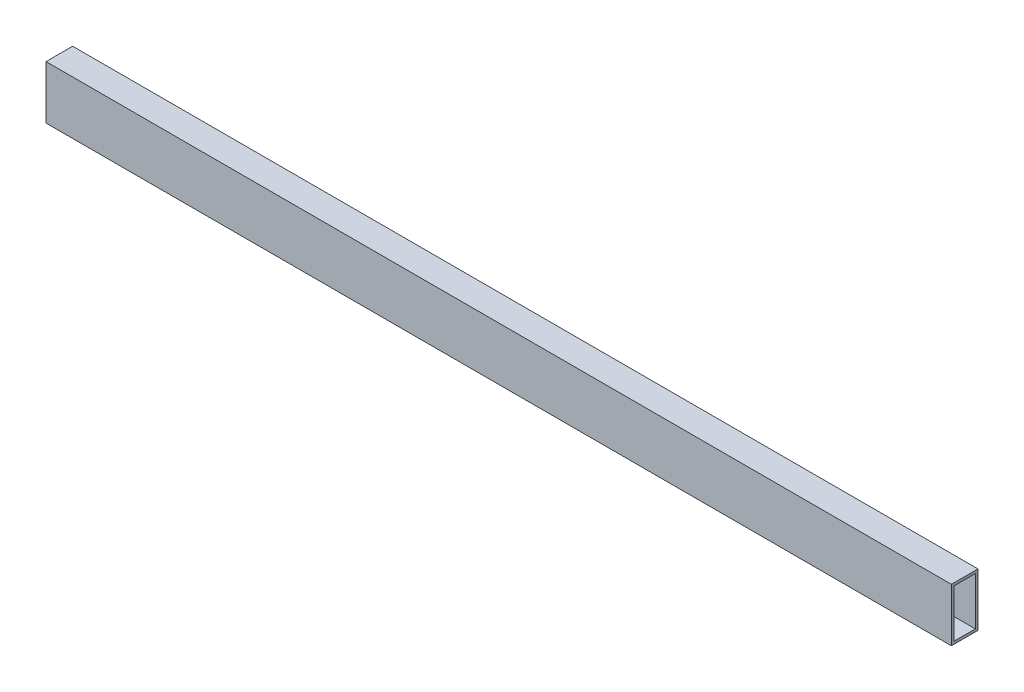
ISO-10303-21;
HEADER;
FILE_DESCRIPTION(('STEP AP214'),'2;1');
FILE_NAME('part.step','',(''),(''),'','','');
FILE_SCHEMA(('AUTOMOTIVE_DESIGN { 1 0 10303 214 1 1 1 1 }'));
ENDSEC;
DATA;
#1=APPLICATION_CONTEXT('core data for automotive mechanical design processes');
#2=APPLICATION_PROTOCOL_DEFINITION('international standard','automotive_design',2000,#1);
#3=PRODUCT_CONTEXT('',#1,'mechanical');
#4=PRODUCT('Part','Part','',(#3));
#5=PRODUCT_RELATED_PRODUCT_CATEGORY('part','',(#4));
#6=PRODUCT_DEFINITION_FORMATION('','',#4);
#7=PRODUCT_DEFINITION_CONTEXT('part definition',#1,'design');
#8=PRODUCT_DEFINITION('design','',#6,#7);
#9=PRODUCT_DEFINITION_SHAPE('','',#8);
#10=(LENGTH_UNIT() NAMED_UNIT(*) SI_UNIT(.MILLI.,.METRE.));
#11=(NAMED_UNIT(*) PLANE_ANGLE_UNIT() SI_UNIT($,.RADIAN.));
#12=(NAMED_UNIT(*) SI_UNIT($,.STERADIAN.) SOLID_ANGLE_UNIT());
#13=UNCERTAINTY_MEASURE_WITH_UNIT(LENGTH_MEASURE(1.E-05),#10,'distance_accuracy_value','');
#14=(GEOMETRIC_REPRESENTATION_CONTEXT(3) GLOBAL_UNCERTAINTY_ASSIGNED_CONTEXT((#13)) GLOBAL_UNIT_ASSIGNED_CONTEXT((#10,
#11,#12)) REPRESENTATION_CONTEXT('',''));
#15=CARTESIAN_POINT('',(0.,0.,0.));
#16=DIRECTION('',(0.,0.,1.));
#17=DIRECTION('',(1.,0.,0.));
#18=AXIS2_PLACEMENT_3D('',#15,#16,#17);
#19=CARTESIAN_POINT('',(1700.,0.,0.));
#20=DIRECTION('',(-1.,0.,0.));
#21=DIRECTION('',(0.,0.,1.));
#22=AXIS2_PLACEMENT_3D('',#19,#20,#21);
#23=PLANE('',#22);
#24=DIRECTION('',(0.,-1.,0.));
#25=VECTOR('',#24,1.);
#26=CARTESIAN_POINT('',(1700.,0.,0.));
#27=LINE('',#26,#25);
#28=CARTESIAN_POINT('',(1700.,100.,0.));
#29=VERTEX_POINT('',#28);
#30=CARTESIAN_POINT('',(1700.,0.,0.));
#31=VERTEX_POINT('',#30);
#32=EDGE_CURVE('E136',#29,#31,#27,.T.);
#33=ORIENTED_EDGE('',*,*,#32,.T.);
#34=DIRECTION('',(0.,0.,-1.));
#35=VECTOR('',#34,1.);
#36=CARTESIAN_POINT('',(1700.,0.,0.));
#37=LINE('',#36,#35);
#38=CARTESIAN_POINT('',(1700.,0.,-50.));
#39=VERTEX_POINT('',#38);
#40=EDGE_CURVE('E139',#31,#39,#37,.T.);
#41=ORIENTED_EDGE('',*,*,#40,.T.);
#42=DIRECTION('',(0.,1.,0.));
#43=VECTOR('',#42,1.);
#44=CARTESIAN_POINT('',(1700.,0.,-50.));
#45=LINE('',#44,#43);
#46=CARTESIAN_POINT('',(1700.,100.,-50.));
#47=VERTEX_POINT('',#46);
#48=EDGE_CURVE('E142',#39,#47,#45,.T.);
#49=ORIENTED_EDGE('',*,*,#48,.T.);
#50=DIRECTION('',(0.,0.,1.));
#51=VECTOR('',#50,1.);
#52=CARTESIAN_POINT('',(1700.,100.,0.));
#53=LINE('',#52,#51);
#54=EDGE_CURVE('E144',#47,#29,#53,.T.);
#55=ORIENTED_EDGE('',*,*,#54,.T.);
#56=EDGE_LOOP('',(#33,#41,#49,#55));
#57=FACE_BOUND('',#56,.T.);
#58=DIRECTION('',(0.,0.,-1.));
#59=VECTOR('',#58,1.);
#60=CARTESIAN_POINT('',(1700.,5.,-5.));
#61=LINE('',#60,#59);
#62=CARTESIAN_POINT('',(1700.,5.,-5.));
#63=VERTEX_POINT('',#62);
#64=CARTESIAN_POINT('',(1700.,5.,-45.));
#65=VERTEX_POINT('',#64);
#66=EDGE_CURVE('E100',#63,#65,#61,.T.);
#67=ORIENTED_EDGE('',*,*,#66,.F.);
#68=DIRECTION('',(0.,-1.,0.));
#69=VECTOR('',#68,1.);
#70=CARTESIAN_POINT('',(1700.,5.,-5.));
#71=LINE('',#70,#69);
#72=CARTESIAN_POINT('',(1700.,95.,-5.));
#73=VERTEX_POINT('',#72);
#74=EDGE_CURVE('E122',#73,#63,#71,.T.);
#75=ORIENTED_EDGE('',*,*,#74,.F.);
#76=DIRECTION('',(0.,0.,1.));
#77=VECTOR('',#76,1.);
#78=CARTESIAN_POINT('',(1700.,95.,-5.));
#79=LINE('',#78,#77);
#80=CARTESIAN_POINT('',(1700.,95.,-45.));
#81=VERTEX_POINT('',#80);
#82=EDGE_CURVE('E120',#81,#73,#79,.T.);
#83=ORIENTED_EDGE('',*,*,#82,.F.);
#84=DIRECTION('',(0.,1.,0.));
#85=VECTOR('',#84,1.);
#86=CARTESIAN_POINT('',(1700.,5.,-45.));
#87=LINE('',#86,#85);
#88=EDGE_CURVE('E108',#65,#81,#87,.T.);
#89=ORIENTED_EDGE('',*,*,#88,.F.);
#90=EDGE_LOOP('',(#67,#75,#83,#89));
#91=FACE_BOUND('',#90,.T.);
#92=ADVANCED_FACE('F35',(#57,#91),#23,.F.);
#93=CARTESIAN_POINT('',(0.,0.,0.));
#94=DIRECTION('',(-1.,0.,0.));
#95=DIRECTION('',(0.,0.,1.));
#96=AXIS2_PLACEMENT_3D('',#93,#94,#95);
#97=PLANE('',#96);
#98=DIRECTION('',(0.,-1.,0.));
#99=VECTOR('',#98,1.);
#100=CARTESIAN_POINT('',(0.,0.,0.));
#101=LINE('',#100,#99);
#102=CARTESIAN_POINT('',(0.,100.,0.));
#103=VERTEX_POINT('',#102);
#104=CARTESIAN_POINT('',(0.,0.,0.));
#105=VERTEX_POINT('',#104);
#106=EDGE_CURVE('E116',#103,#105,#101,.T.);
#107=ORIENTED_EDGE('',*,*,#106,.F.);
#108=DIRECTION('',(0.,0.,1.));
#109=VECTOR('',#108,1.);
#110=CARTESIAN_POINT('',(0.,100.,0.));
#111=LINE('',#110,#109);
#112=CARTESIAN_POINT('',(0.,100.,-50.));
#113=VERTEX_POINT('',#112);
#114=EDGE_CURVE('E140',#113,#103,#111,.T.);
#115=ORIENTED_EDGE('',*,*,#114,.F.);
#116=DIRECTION('',(0.,1.,0.));
#117=VECTOR('',#116,1.);
#118=CARTESIAN_POINT('',(0.,0.,-50.));
#119=LINE('',#118,#117);
#120=CARTESIAN_POINT('',(0.,0.,-50.));
#121=VERTEX_POINT('',#120);
#122=EDGE_CURVE('E151',#121,#113,#119,.T.);
#123=ORIENTED_EDGE('',*,*,#122,.F.);
#124=DIRECTION('',(0.,0.,-1.));
#125=VECTOR('',#124,1.);
#126=CARTESIAN_POINT('',(0.,0.,0.));
#127=LINE('',#126,#125);
#128=EDGE_CURVE('E149',#105,#121,#127,.T.);
#129=ORIENTED_EDGE('',*,*,#128,.F.);
#130=EDGE_LOOP('',(#107,#115,#123,#129));
#131=FACE_BOUND('',#130,.T.);
#132=DIRECTION('',(0.,-1.,0.));
#133=VECTOR('',#132,1.);
#134=CARTESIAN_POINT('',(0.,5.,-5.));
#135=LINE('',#134,#133);
#136=CARTESIAN_POINT('',(0.,95.,-5.));
#137=VERTEX_POINT('',#136);
#138=CARTESIAN_POINT('',(0.,5.,-5.));
#139=VERTEX_POINT('',#138);
#140=EDGE_CURVE('E109',#137,#139,#135,.T.);
#141=ORIENTED_EDGE('',*,*,#140,.T.);
#142=DIRECTION('',(0.,0.,-1.));
#143=VECTOR('',#142,1.);
#144=CARTESIAN_POINT('',(0.,5.,-5.));
#145=LINE('',#144,#143);
#146=CARTESIAN_POINT('',(0.,5.,-45.));
#147=VERTEX_POINT('',#146);
#148=EDGE_CURVE('E58',#139,#147,#145,.T.);
#149=ORIENTED_EDGE('',*,*,#148,.T.);
#150=DIRECTION('',(0.,1.,0.));
#151=VECTOR('',#150,1.);
#152=CARTESIAN_POINT('',(0.,5.,-45.));
#153=LINE('',#152,#151);
#154=CARTESIAN_POINT('',(0.,95.,-45.));
#155=VERTEX_POINT('',#154);
#156=EDGE_CURVE('E115',#147,#155,#153,.T.);
#157=ORIENTED_EDGE('',*,*,#156,.T.);
#158=DIRECTION('',(0.,0.,1.));
#159=VECTOR('',#158,1.);
#160=CARTESIAN_POINT('',(0.,95.,-5.));
#161=LINE('',#160,#159);
#162=EDGE_CURVE('E128',#155,#137,#161,.T.);
#163=ORIENTED_EDGE('',*,*,#162,.T.);
#164=EDGE_LOOP('',(#141,#149,#157,#163));
#165=FACE_BOUND('',#164,.T.);
#166=ADVANCED_FACE('F169',(#131,#165),#97,.T.);
#167=CARTESIAN_POINT('',(1700.,0.,0.));
#168=DIRECTION('',(0.,0.,-1.));
#169=DIRECTION('',(-1.,0.,0.));
#170=AXIS2_PLACEMENT_3D('',#167,#168,#169);
#171=PLANE('',#170);
#172=ORIENTED_EDGE('',*,*,#106,.T.);
#173=DIRECTION('',(-1.,0.,0.));
#174=VECTOR('',#173,1.);
#175=CARTESIAN_POINT('',(1700.,0.,0.));
#176=LINE('',#175,#174);
#177=EDGE_CURVE('E11',#31,#105,#176,.T.);
#178=ORIENTED_EDGE('',*,*,#177,.F.);
#179=ORIENTED_EDGE('',*,*,#32,.F.);
#180=DIRECTION('',(-1.,0.,0.));
#181=VECTOR('',#180,1.);
#182=CARTESIAN_POINT('',(1700.,100.,0.));
#183=LINE('',#182,#181);
#184=EDGE_CURVE('E146',#29,#103,#183,.T.);
#185=ORIENTED_EDGE('',*,*,#184,.T.);
#186=EDGE_LOOP('',(#172,#178,#179,#185));
#187=FACE_BOUND('',#186,.T.);
#188=ADVANCED_FACE('F37',(#187),#171,.F.);
#189=CARTESIAN_POINT('',(1700.,0.,0.));
#190=DIRECTION('',(0.,1.,0.));
#191=DIRECTION('',(0.,0.,1.));
#192=AXIS2_PLACEMENT_3D('',#189,#190,#191);
#193=PLANE('',#192);
#194=ORIENTED_EDGE('',*,*,#128,.T.);
#195=DIRECTION('',(-1.,0.,0.));
#196=VECTOR('',#195,1.);
#197=CARTESIAN_POINT('',(1700.,0.,-50.));
#198=LINE('',#197,#196);
#199=EDGE_CURVE('E43',#39,#121,#198,.T.);
#200=ORIENTED_EDGE('',*,*,#199,.F.);
#201=ORIENTED_EDGE('',*,*,#40,.F.);
#202=ORIENTED_EDGE('',*,*,#177,.T.);
#203=EDGE_LOOP('',(#194,#200,#201,#202));
#204=FACE_BOUND('',#203,.T.);
#205=ADVANCED_FACE('F179',(#204),#193,.F.);
#206=CARTESIAN_POINT('',(1700.,0.,-50.));
#207=DIRECTION('',(0.,0.,1.));
#208=DIRECTION('',(1.,0.,0.));
#209=AXIS2_PLACEMENT_3D('',#206,#207,#208);
#210=PLANE('',#209);
#211=ORIENTED_EDGE('',*,*,#122,.T.);
#212=DIRECTION('',(-1.,0.,0.));
#213=VECTOR('',#212,1.);
#214=CARTESIAN_POINT('',(1700.,100.,-50.));
#215=LINE('',#214,#213);
#216=EDGE_CURVE('E156',#47,#113,#215,.T.);
#217=ORIENTED_EDGE('',*,*,#216,.F.);
#218=ORIENTED_EDGE('',*,*,#48,.F.);
#219=ORIENTED_EDGE('',*,*,#199,.T.);
#220=EDGE_LOOP('',(#211,#217,#218,#219));
#221=FACE_BOUND('',#220,.T.);
#222=ADVANCED_FACE('F163',(#221),#210,.F.);
#223=CARTESIAN_POINT('',(1700.,100.,0.));
#224=DIRECTION('',(0.,-1.,0.));
#225=DIRECTION('',(0.,0.,-1.));
#226=AXIS2_PLACEMENT_3D('',#223,#224,#225);
#227=PLANE('',#226);
#228=ORIENTED_EDGE('',*,*,#114,.T.);
#229=ORIENTED_EDGE('',*,*,#184,.F.);
#230=ORIENTED_EDGE('',*,*,#54,.F.);
#231=ORIENTED_EDGE('',*,*,#216,.T.);
#232=EDGE_LOOP('',(#228,#229,#230,#231));
#233=FACE_BOUND('',#232,.T.);
#234=ADVANCED_FACE('F173',(#233),#227,.F.);
#235=CARTESIAN_POINT('',(1700.,5.,-5.));
#236=DIRECTION('',(0.,1.,0.));
#237=DIRECTION('',(0.,0.,1.));
#238=AXIS2_PLACEMENT_3D('',#235,#236,#237);
#239=PLANE('',#238);
#240=ORIENTED_EDGE('',*,*,#148,.F.);
#241=DIRECTION('',(-1.,0.,0.));
#242=VECTOR('',#241,1.);
#243=CARTESIAN_POINT('',(1700.,5.,-5.));
#244=LINE('',#243,#242);
#245=EDGE_CURVE('E104',#63,#139,#244,.T.);
#246=ORIENTED_EDGE('',*,*,#245,.F.);
#247=ORIENTED_EDGE('',*,*,#66,.T.);
#248=DIRECTION('',(-1.,0.,0.));
#249=VECTOR('',#248,1.);
#250=CARTESIAN_POINT('',(1700.,5.,-45.));
#251=LINE('',#250,#249);
#252=EDGE_CURVE('E103',#65,#147,#251,.T.);
#253=ORIENTED_EDGE('',*,*,#252,.T.);
#254=EDGE_LOOP('',(#240,#246,#247,#253));
#255=FACE_BOUND('',#254,.T.);
#256=ADVANCED_FACE('F102',(#255),#239,.T.);
#257=CARTESIAN_POINT('',(1700.,5.,-45.));
#258=DIRECTION('',(0.,0.,1.));
#259=DIRECTION('',(1.,0.,0.));
#260=AXIS2_PLACEMENT_3D('',#257,#258,#259);
#261=PLANE('',#260);
#262=ORIENTED_EDGE('',*,*,#156,.F.);
#263=ORIENTED_EDGE('',*,*,#252,.F.);
#264=ORIENTED_EDGE('',*,*,#88,.T.);
#265=DIRECTION('',(-1.,0.,0.));
#266=VECTOR('',#265,1.);
#267=CARTESIAN_POINT('',(1700.,95.,-45.));
#268=LINE('',#267,#266);
#269=EDGE_CURVE('E117',#81,#155,#268,.T.);
#270=ORIENTED_EDGE('',*,*,#269,.T.);
#271=EDGE_LOOP('',(#262,#263,#264,#270));
#272=FACE_BOUND('',#271,.T.);
#273=ADVANCED_FACE('F112',(#272),#261,.T.);
#274=CARTESIAN_POINT('',(1700.,95.,-5.));
#275=DIRECTION('',(0.,-1.,0.));
#276=DIRECTION('',(0.,0.,-1.));
#277=AXIS2_PLACEMENT_3D('',#274,#275,#276);
#278=PLANE('',#277);
#279=ORIENTED_EDGE('',*,*,#162,.F.);
#280=ORIENTED_EDGE('',*,*,#269,.F.);
#281=ORIENTED_EDGE('',*,*,#82,.T.);
#282=DIRECTION('',(-1.,0.,0.));
#283=VECTOR('',#282,1.);
#284=CARTESIAN_POINT('',(1700.,95.,-5.));
#285=LINE('',#284,#283);
#286=EDGE_CURVE('E50',#73,#137,#285,.T.);
#287=ORIENTED_EDGE('',*,*,#286,.T.);
#288=EDGE_LOOP('',(#279,#280,#281,#287));
#289=FACE_BOUND('',#288,.T.);
#290=ADVANCED_FACE('F202',(#289),#278,.T.);
#291=CARTESIAN_POINT('',(1700.,5.,-5.));
#292=DIRECTION('',(0.,0.,-1.));
#293=DIRECTION('',(-1.,0.,0.));
#294=AXIS2_PLACEMENT_3D('',#291,#292,#293);
#295=PLANE('',#294);
#296=ORIENTED_EDGE('',*,*,#140,.F.);
#297=ORIENTED_EDGE('',*,*,#286,.F.);
#298=ORIENTED_EDGE('',*,*,#74,.T.);
#299=ORIENTED_EDGE('',*,*,#245,.T.);
#300=EDGE_LOOP('',(#296,#297,#298,#299));
#301=FACE_BOUND('',#300,.T.);
#302=ADVANCED_FACE('F206',(#301),#295,.T.);
#303=CLOSED_SHELL('',(#92,#166,#188,#205,#222,#234,#256,#273,#290,#302));
#304=MANIFOLD_SOLID_BREP('B2',#303);
#305=ADVANCED_BREP_SHAPE_REPRESENTATION('',(#18,#304),#14);
#306=SHAPE_DEFINITION_REPRESENTATION(#9,#305);
ENDSEC;
END-ISO-10303-21;
